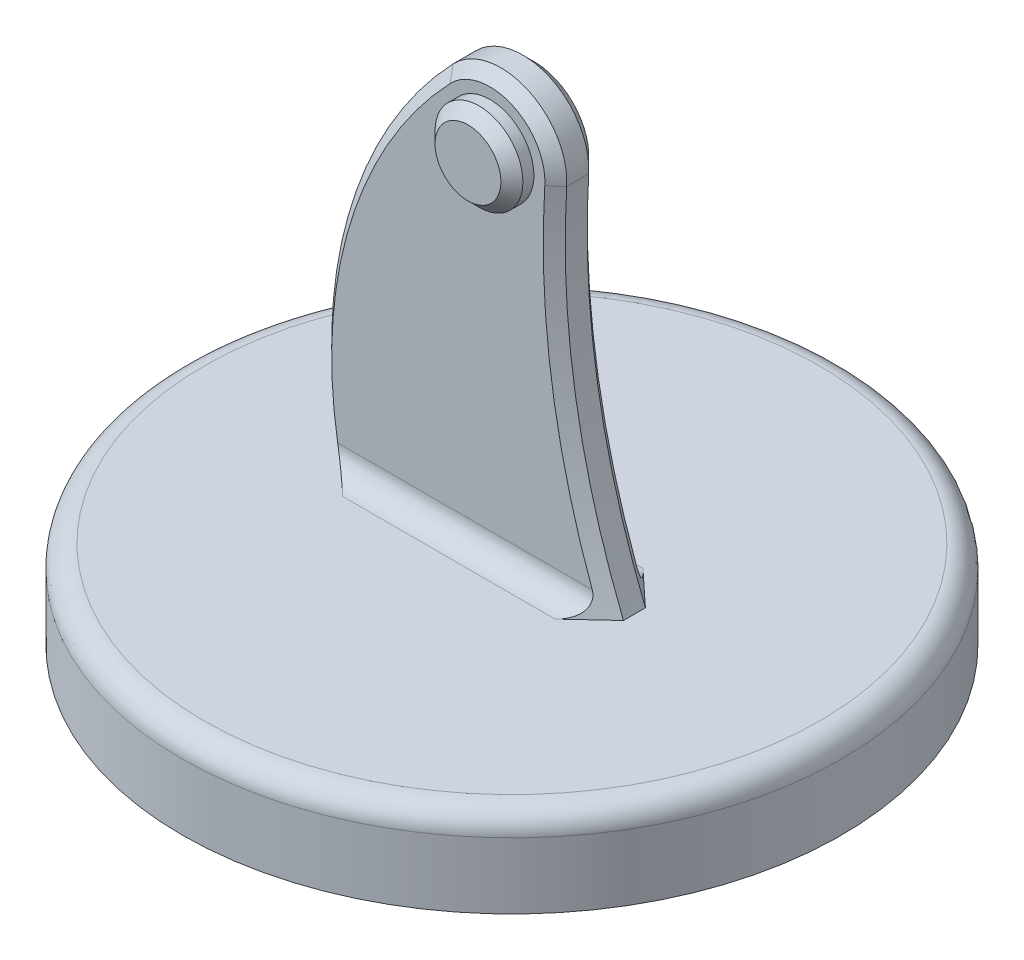
ISO-10303-21;
HEADER;
FILE_DESCRIPTION(('STEP AP214'),'2;1');
FILE_NAME('part.step','',(''),(''),'','','');
FILE_SCHEMA(('AUTOMOTIVE_DESIGN { 1 0 10303 214 1 1 1 1 }'));
ENDSEC;
DATA;
#1=APPLICATION_CONTEXT('core data for automotive mechanical design processes');
#2=APPLICATION_PROTOCOL_DEFINITION('international standard','automotive_design',2000,#1);
#3=PRODUCT_CONTEXT('',#1,'mechanical');
#4=PRODUCT('Part','Part','',(#3));
#5=PRODUCT_RELATED_PRODUCT_CATEGORY('part','',(#4));
#6=PRODUCT_DEFINITION_FORMATION('','',#4);
#7=PRODUCT_DEFINITION_CONTEXT('part definition',#1,'design');
#8=PRODUCT_DEFINITION('design','',#6,#7);
#9=PRODUCT_DEFINITION_SHAPE('','',#8);
#10=(LENGTH_UNIT() NAMED_UNIT(*) SI_UNIT(.MILLI.,.METRE.));
#11=(NAMED_UNIT(*) PLANE_ANGLE_UNIT() SI_UNIT($,.RADIAN.));
#12=(NAMED_UNIT(*) SI_UNIT($,.STERADIAN.) SOLID_ANGLE_UNIT());
#13=UNCERTAINTY_MEASURE_WITH_UNIT(LENGTH_MEASURE(1.E-05),#10,'distance_accuracy_value','');
#14=(GEOMETRIC_REPRESENTATION_CONTEXT(3) GLOBAL_UNCERTAINTY_ASSIGNED_CONTEXT((#13)) GLOBAL_UNIT_ASSIGNED_CONTEXT((#10,
#11,#12)) REPRESENTATION_CONTEXT('',''));
#15=CARTESIAN_POINT('',(0.,0.,0.));
#16=DIRECTION('',(0.,0.,1.));
#17=DIRECTION('',(1.,0.,0.));
#18=AXIS2_PLACEMENT_3D('',#15,#16,#17);
#19=CARTESIAN_POINT('',(0.,20.,0.));
#20=DIRECTION('',(0.,1.,0.));
#21=DIRECTION('',(0.,0.,1.));
#22=AXIS2_PLACEMENT_3D('',#19,#20,#21);
#23=PLANE('',#22);
#24=CARTESIAN_POINT('',(0.,20.,0.));
#25=DIRECTION('',(0.,1.,0.));
#26=DIRECTION('',(0.,0.,1.));
#27=AXIS2_PLACEMENT_3D('',#24,#25,#26);
#28=CIRCLE('',#27,70.);
#29=CARTESIAN_POINT('',(0.,20.,70.));
#30=VERTEX_POINT('',#29);
#31=EDGE_CURVE('E329',#30,#30,#28,.T.);
#32=ORIENTED_EDGE('',*,*,#31,.T.);
#33=EDGE_LOOP('',(#32));
#34=FACE_BOUND('',#33,.T.);
#35=CARTESIAN_POINT('',(-36.2257918410724,20.,-2.50000000000003));
#36=CARTESIAN_POINT('',(-35.372613344394,20.,-3.33359235450623));
#37=CARTESIAN_POINT('',(-34.5191891841924,20.,-4.16693335697092));
#38=CARTESIAN_POINT('',(-32.810937278002,20.,-5.83391380233447));
#39=CARTESIAN_POINT('',(-31.9561089872259,20.,-6.66755268694829));
#40=CARTESIAN_POINT('',(-30.2458713230933,20.,-8.33423473891845));
#41=CARTESIAN_POINT('',(-29.3904619495461,20.,-9.16727790607919));
#42=CARTESIAN_POINT('',(-28.5347400447996,20.,-9.99999999999038));
#43=B_SPLINE_CURVE_WITH_KNOTS('',3,(#35,#36,#37,#38,#39,#40,#41,#42),.UNSPECIFIED.,.F.,.F.,(4,2,
2,4),(0.,3.57842257820067,7.16048411375383,10.7425468249049),.UNSPECIFIED.);
#44=CARTESIAN_POINT('',(-36.2257918410724,20.,-2.50000000000003));
#45=VERTEX_POINT('',#44);
#46=CARTESIAN_POINT('',(-28.5347400447996,20.,-10.));
#47=VERTEX_POINT('',#46);
#48=EDGE_CURVE('E180',#45,#47,#43,.T.);
#49=ORIENTED_EDGE('',*,*,#48,.T.);
#50=DIRECTION('',(-1.,0.,0.));
#51=VECTOR('',#50,1.);
#52=CARTESIAN_POINT('',(25.1824752050036,20.,-10.));
#53=LINE('',#52,#51);
#54=CARTESIAN_POINT('',(19.8084097202195,20.,-10.));
#55=VERTEX_POINT('',#54);
#56=EDGE_CURVE('E273',#47,#55,#53,.F.);
#57=ORIENTED_EDGE('',*,*,#56,.T.);
#58=CARTESIAN_POINT('',(19.8084097202195,20.,-9.99999999999998));
#59=CARTESIAN_POINT('',(20.7032286114694,20.,-9.16574365323035));
#60=CARTESIAN_POINT('',(21.5984643871197,20.,-8.33193432974238));
#61=CARTESIAN_POINT('',(23.3898068938444,20.,-6.6652533617684));
#62=CARTESIAN_POINT('',(24.2859136241593,20.,-5.83238171646611));
#63=CARTESIAN_POINT('',(26.0805990637617,20.,-4.1661678404195));
#64=CARTESIAN_POINT('',(26.979179359604,20.,-3.33282731858596));
#65=CARTESIAN_POINT('',(27.8782351753599,20.,-2.50000000000003));
#66=B_SPLINE_CURVE_WITH_KNOTS('',3,(#58,#59,#60,#61,#62,#63,#64,#65),.UNSPECIFIED.,.F.,.F.,(4,2,
2,4),(0.,3.67017170974668,7.34034022201683,11.0169040821688),.UNSPECIFIED.);
#67=CARTESIAN_POINT('',(27.8782351753599,20.,-2.50000000000003));
#68=VERTEX_POINT('',#67);
#69=EDGE_CURVE('E126',#55,#68,#66,.T.);
#70=ORIENTED_EDGE('',*,*,#69,.T.);
#71=DIRECTION('',(0.,0.,-1.));
#72=VECTOR('',#71,1.);
#73=CARTESIAN_POINT('',(27.8782351753599,20.,5.));
#74=LINE('',#73,#72);
#75=CARTESIAN_POINT('',(27.8782351753599,20.,2.5));
#76=VERTEX_POINT('',#75);
#77=EDGE_CURVE('E137',#68,#76,#74,.F.);
#78=ORIENTED_EDGE('',*,*,#77,.T.);
#79=CARTESIAN_POINT('',(27.8782351753599,20.,2.5));
#80=CARTESIAN_POINT('',(26.979179359604,20.,3.33282731858594));
#81=CARTESIAN_POINT('',(26.0805990637617,20.,4.16616784041949));
#82=CARTESIAN_POINT('',(24.2859136241593,20.,5.8323817164661));
#83=CARTESIAN_POINT('',(23.3898068938444,20.,6.6652533617684));
#84=CARTESIAN_POINT('',(21.5984643871197,20.,8.33193432974238));
#85=CARTESIAN_POINT('',(20.7032286114694,20.,9.16574365323036));
#86=CARTESIAN_POINT('',(19.8084097202196,20.,10.));
#87=B_SPLINE_CURVE_WITH_KNOTS('',3,(#79,#80,#81,#82,#83,#84,#85,#86),.UNSPECIFIED.,.F.,.F.,(4,2,
2,4),(0.,3.676563860152,7.34673237242213,11.0169040821688),.UNSPECIFIED.);
#88=CARTESIAN_POINT('',(19.8084097202196,20.,10.));
#89=VERTEX_POINT('',#88);
#90=EDGE_CURVE('E125',#76,#89,#87,.T.);
#91=ORIENTED_EDGE('',*,*,#90,.T.);
#92=DIRECTION('',(-1.,0.,0.));
#93=VECTOR('',#92,1.);
#94=CARTESIAN_POINT('',(0.,20.,10.));
#95=LINE('',#94,#93);
#96=CARTESIAN_POINT('',(-28.5347400447898,20.,10.));
#97=VERTEX_POINT('',#96);
#98=EDGE_CURVE('E122',#89,#97,#95,.T.);
#99=ORIENTED_EDGE('',*,*,#98,.T.);
#100=CARTESIAN_POINT('',(-28.5347400447898,20.,10.));
#101=CARTESIAN_POINT('',(-29.3904619495379,20.,9.16727790608721));
#102=CARTESIAN_POINT('',(-30.2458713230867,20.,8.33423473892486));
#103=CARTESIAN_POINT('',(-31.9561089872226,20.,6.6675526869515));
#104=CARTESIAN_POINT('',(-32.8109372780004,20.,5.83391380233608));
#105=CARTESIAN_POINT('',(-34.5191891841924,20.,4.16693335697091));
#106=CARTESIAN_POINT('',(-35.372613344394,20.,3.33359235450622));
#107=CARTESIAN_POINT('',(-36.2257918410724,20.,2.5));
#108=B_SPLINE_CURVE_WITH_KNOTS('',3,(#100,#101,#102,#103,#104,#105,#106,#107),.UNSPECIFIED.,.F.,
.F.,(4,2,2,4),(0.,3.58206271115796,7.164124246718,10.7425468249187),.UNSPECIFIED.);
#109=CARTESIAN_POINT('',(-36.2257918410724,20.,2.5));
#110=VERTEX_POINT('',#109);
#111=EDGE_CURVE('E118',#97,#110,#108,.T.);
#112=ORIENTED_EDGE('',*,*,#111,.T.);
#113=DIRECTION('',(0.,0.,-1.));
#114=VECTOR('',#113,1.);
#115=CARTESIAN_POINT('',(-36.2257918410724,20.,5.));
#116=LINE('',#115,#114);
#117=EDGE_CURVE('E120',#110,#45,#116,.T.);
#118=ORIENTED_EDGE('',*,*,#117,.T.);
#119=EDGE_LOOP('',(#49,#57,#70,#78,#91,#99,#112,#118));
#120=FACE_BOUND('',#119,.T.);
#121=ADVANCED_FACE('F39',(#34,#120),#23,.T.);
#122=CARTESIAN_POINT('',(0.,20.,0.));
#123=DIRECTION('',(0.,-1.,0.));
#124=DIRECTION('',(0.,0.,-1.));
#125=AXIS2_PLACEMENT_3D('',#122,#123,#124);
#126=CYLINDRICAL_SURFACE('',#125,75.);
#127=CARTESIAN_POINT('',(0.,15.,0.));
#128=DIRECTION('',(0.,1.,0.));
#129=DIRECTION('',(0.,0.,1.));
#130=AXIS2_PLACEMENT_3D('',#127,#128,#129);
#131=CIRCLE('',#130,75.);
#132=CARTESIAN_POINT('',(0.,15.,75.));
#133=VERTEX_POINT('',#132);
#134=EDGE_CURVE('E326',#133,#133,#131,.F.);
#135=ORIENTED_EDGE('',*,*,#134,.T.);
#136=EDGE_LOOP('',(#135));
#137=FACE_BOUND('',#136,.T.);
#138=CARTESIAN_POINT('',(0.,0.,0.));
#139=DIRECTION('',(0.,1.,0.));
#140=DIRECTION('',(0.,0.,1.));
#141=AXIS2_PLACEMENT_3D('',#138,#139,#140);
#142=CIRCLE('',#141,75.);
#143=CARTESIAN_POINT('',(0.,0.,75.));
#144=VERTEX_POINT('',#143);
#145=EDGE_CURVE('E335',#144,#144,#142,.T.);
#146=ORIENTED_EDGE('',*,*,#145,.T.);
#147=EDGE_LOOP('',(#146));
#148=FACE_BOUND('',#147,.T.);
#149=ADVANCED_FACE('F202',(#137,#148),#126,.T.);
#150=CARTESIAN_POINT('',(0.,0.,0.));
#151=DIRECTION('',(0.,1.,0.));
#152=DIRECTION('',(0.,0.,1.));
#153=AXIS2_PLACEMENT_3D('',#150,#151,#152);
#154=PLANE('',#153);
#155=ORIENTED_EDGE('',*,*,#145,.F.);
#156=EDGE_LOOP('',(#155));
#157=FACE_BOUND('',#156,.T.);
#158=ADVANCED_FACE('F205',(#157),#154,.F.);
#159=CARTESIAN_POINT('',(0.,15.,0.));
#160=DIRECTION('',(0.,1.,0.));
#161=DIRECTION('',(0.,0.,1.));
#162=AXIS2_PLACEMENT_3D('',#159,#160,#161);
#163=TOROIDAL_SURFACE('',#162,70.,5.);
#164=ORIENTED_EDGE('',*,*,#134,.F.);
#165=EDGE_LOOP('',(#164));
#166=FACE_BOUND('',#165,.T.);
#167=ORIENTED_EDGE('',*,*,#31,.F.);
#168=EDGE_LOOP('',(#167));
#169=FACE_BOUND('',#168,.T.);
#170=ADVANCED_FACE('F378',(#166,#169),#163,.T.);
#171=CARTESIAN_POINT('',(61.4788080980091,41.3028437243492,5.));
#172=DIRECTION('',(0.,0.,-1.));
#173=DIRECTION('',(-1.,0.,0.));
#174=AXIS2_PLACEMENT_3D('',#171,#172,#173);
#175=CYLINDRICAL_SURFACE('',#174,100.);
#176=DIRECTION('',(0.,0.,-1.));
#177=VECTOR('',#176,1.);
#178=CARTESIAN_POINT('',(-10.8492014290605,110.358321695703,5.));
#179=LINE('',#178,#177);
#180=CARTESIAN_POINT('',(-10.8492014290605,110.358321695703,2.5));
#181=VERTEX_POINT('',#180);
#182=CARTESIAN_POINT('',(-10.8492014290605,110.358321695703,-2.50000000000003));
#183=VERTEX_POINT('',#182);
#184=EDGE_CURVE('E294',#181,#183,#179,.T.);
#185=ORIENTED_EDGE('',*,*,#184,.T.);
#186=CARTESIAN_POINT('',(61.4788080980091,41.3028437243492,-2.50000000000003));
#187=DIRECTION('',(0.,0.,-1.));
#188=DIRECTION('',(-1.,0.,0.));
#189=AXIS2_PLACEMENT_3D('',#186,#187,#188);
#190=CIRCLE('',#189,100.);
#191=EDGE_CURVE('E135',#183,#45,#190,.F.);
#192=ORIENTED_EDGE('',*,*,#191,.T.);
#193=ORIENTED_EDGE('',*,*,#117,.F.);
#194=CARTESIAN_POINT('',(61.4788080980091,41.3028437243492,2.5));
#195=DIRECTION('',(0.,0.,-1.));
#196=DIRECTION('',(-1.,0.,0.));
#197=AXIS2_PLACEMENT_3D('',#194,#195,#196);
#198=CIRCLE('',#197,100.);
#199=EDGE_CURVE('E132',#110,#181,#198,.T.);
#200=ORIENTED_EDGE('',*,*,#199,.T.);
#201=EDGE_LOOP('',(#185,#192,#193,#200));
#202=FACE_BOUND('',#201,.T.);
#203=ADVANCED_FACE('F131',(#202),#175,.T.);
#204=CARTESIAN_POINT('',(194.618391581677,87.8064911464742,5.));
#205=DIRECTION('',(0.,0.,-1.));
#206=DIRECTION('',(-1.,0.,0.));
#207=AXIS2_PLACEMENT_3D('',#204,#205,#206);
#208=CYLINDRICAL_SURFACE('',#207,180.);
#209=ORIENTED_EDGE('',*,*,#77,.F.);
#210=CARTESIAN_POINT('',(194.618391581677,87.8064911464742,-2.50000000000003));
#211=DIRECTION('',(0.,0.,-1.));
#212=DIRECTION('',(-1.,0.,0.));
#213=AXIS2_PLACEMENT_3D('',#210,#211,#212);
#214=CIRCLE('',#213,180.);
#215=CARTESIAN_POINT('',(14.9706455062829,99.062037780498,-2.50000000000003));
#216=VERTEX_POINT('',#215);
#217=EDGE_CURVE('E168',#68,#216,#214,.T.);
#218=ORIENTED_EDGE('',*,*,#217,.T.);
#219=DIRECTION('',(0.,0.,-1.));
#220=VECTOR('',#219,1.);
#221=CARTESIAN_POINT('',(14.9706455062829,99.062037780498,5.));
#222=LINE('',#221,#220);
#223=CARTESIAN_POINT('',(14.9706455062829,99.062037780498,2.5));
#224=VERTEX_POINT('',#223);
#225=EDGE_CURVE('E339',#224,#216,#222,.T.);
#226=ORIENTED_EDGE('',*,*,#225,.F.);
#227=CARTESIAN_POINT('',(194.618391581677,87.8064911464742,2.5));
#228=DIRECTION('',(0.,0.,-1.));
#229=DIRECTION('',(-1.,0.,0.));
#230=AXIS2_PLACEMENT_3D('',#227,#228,#229);
#231=CIRCLE('',#230,180.);
#232=EDGE_CURVE('E165',#224,#76,#231,.F.);
#233=ORIENTED_EDGE('',*,*,#232,.T.);
#234=EDGE_LOOP('',(#209,#218,#226,#233));
#235=FACE_BOUND('',#234,.T.);
#236=ADVANCED_FACE('F321',(#235),#208,.F.);
#237=CARTESIAN_POINT('',(0.,100.,5.));
#238=DIRECTION('',(0.,0.,-1.));
#239=DIRECTION('',(-1.,0.,0.));
#240=AXIS2_PLACEMENT_3D('',#237,#238,#239);
#241=CYLINDRICAL_SURFACE('',#240,15.0000000000001);
#242=ORIENTED_EDGE('',*,*,#225,.T.);
#243=CARTESIAN_POINT('',(0.,100.,-2.50000000000003));
#244=DIRECTION('',(0.,0.,-1.));
#245=DIRECTION('',(-1.,0.,0.));
#246=AXIS2_PLACEMENT_3D('',#243,#244,#245);
#247=CIRCLE('',#246,15.0000000000001);
#248=EDGE_CURVE('E162',#216,#183,#247,.F.);
#249=ORIENTED_EDGE('',*,*,#248,.T.);
#250=ORIENTED_EDGE('',*,*,#184,.F.);
#251=CARTESIAN_POINT('',(0.,100.,2.5));
#252=DIRECTION('',(0.,0.,-1.));
#253=DIRECTION('',(-1.,0.,0.));
#254=AXIS2_PLACEMENT_3D('',#251,#252,#253);
#255=CIRCLE('',#254,15.0000000000001);
#256=EDGE_CURVE('E159',#181,#224,#255,.T.);
#257=ORIENTED_EDGE('',*,*,#256,.T.);
#258=EDGE_LOOP('',(#242,#249,#250,#257));
#259=FACE_BOUND('',#258,.T.);
#260=ADVANCED_FACE('F367',(#259),#241,.T.);
#261=CARTESIAN_POINT('',(61.4788080980091,41.3028437243492,5.));
#262=DIRECTION('',(0.,0.,-1.));
#263=DIRECTION('',(-1.,0.,0.));
#264=AXIS2_PLACEMENT_3D('',#261,#262,#263);
#265=PLANE('',#264);
#266=CARTESIAN_POINT('',(0.,100.,5.));
#267=DIRECTION('',(0.,0.,-1.));
#268=DIRECTION('',(-1.,0.,0.));
#269=AXIS2_PLACEMENT_3D('',#266,#267,#268);
#270=CIRCLE('',#269,10.);
#271=CARTESIAN_POINT('',(-10.,100.,5.));
#272=VERTEX_POINT('',#271);
#273=EDGE_CURVE('E536',#272,#272,#270,.F.);
#274=ORIENTED_EDGE('',*,*,#273,.F.);
#275=EDGE_LOOP('',(#274));
#276=FACE_BOUND('',#275,.T.);
#277=CARTESIAN_POINT('',(61.4788080980091,41.3028437243492,5.));
#278=DIRECTION('',(0.,0.,-1.));
#279=DIRECTION('',(-1.,0.,0.));
#280=AXIS2_PLACEMENT_3D('',#277,#278,#279);
#281=CIRCLE('',#280,97.5);
#282=CARTESIAN_POINT('',(-9.04100119088374,108.631934746419,5.));
#283=VERTEX_POINT('',#282);
#284=CARTESIAN_POINT('',(-34.6485412178826,25.,5.));
#285=VERTEX_POINT('',#284);
#286=EDGE_CURVE('E177',#283,#285,#281,.F.);
#287=ORIENTED_EDGE('',*,*,#286,.T.);
#288=DIRECTION('',(-1.,0.,0.));
#289=VECTOR('',#288,1.);
#290=CARTESIAN_POINT('',(61.4788080980091,25.,5.));
#291=LINE('',#290,#289);
#292=CARTESIAN_POINT('',(23.2661384016624,25.,5.));
#293=VERTEX_POINT('',#292);
#294=EDGE_CURVE('E55',#285,#293,#291,.F.);
#295=ORIENTED_EDGE('',*,*,#294,.T.);
#296=CARTESIAN_POINT('',(194.618391581677,87.8064911464742,5.));
#297=DIRECTION('',(0.,0.,-1.));
#298=DIRECTION('',(-1.,0.,0.));
#299=AXIS2_PLACEMENT_3D('',#296,#297,#298);
#300=CIRCLE('',#299,182.5);
#301=CARTESIAN_POINT('',(12.4755379219024,99.2183648170816,5.));
#302=VERTEX_POINT('',#301);
#303=EDGE_CURVE('E171',#293,#302,#300,.T.);
#304=ORIENTED_EDGE('',*,*,#303,.T.);
#305=CARTESIAN_POINT('',(0.,100.,5.));
#306=DIRECTION('',(0.,0.,-1.));
#307=DIRECTION('',(-1.,0.,0.));
#308=AXIS2_PLACEMENT_3D('',#305,#306,#307);
#309=CIRCLE('',#308,12.5000000000001);
#310=EDGE_CURVE('E174',#302,#283,#309,.F.);
#311=ORIENTED_EDGE('',*,*,#310,.T.);
#312=EDGE_LOOP('',(#287,#295,#304,#311));
#313=FACE_BOUND('',#312,.T.);
#314=ADVANCED_FACE('F361',(#276,#313),#265,.F.);
#315=CARTESIAN_POINT('',(61.4788080980091,41.3028437243492,-5.));
#316=DIRECTION('',(0.,0.,-1.));
#317=DIRECTION('',(-1.,0.,0.));
#318=AXIS2_PLACEMENT_3D('',#315,#316,#317);
#319=PLANE('',#318);
#320=CARTESIAN_POINT('',(0.,100.,-5.));
#321=DIRECTION('',(0.,0.,-1.));
#322=DIRECTION('',(-1.,0.,0.));
#323=AXIS2_PLACEMENT_3D('',#320,#321,#322);
#324=CIRCLE('',#323,5.);
#325=CARTESIAN_POINT('',(-5.,100.,-5.));
#326=VERTEX_POINT('',#325);
#327=EDGE_CURVE('E344',#326,#326,#324,.T.);
#328=ORIENTED_EDGE('',*,*,#327,.F.);
#329=EDGE_LOOP('',(#328));
#330=FACE_BOUND('',#329,.T.);
#331=CARTESIAN_POINT('',(194.618391581677,87.8064911464742,-5.));
#332=DIRECTION('',(0.,0.,-1.));
#333=DIRECTION('',(-1.,0.,0.));
#334=AXIS2_PLACEMENT_3D('',#331,#332,#333);
#335=CIRCLE('',#334,182.5);
#336=CARTESIAN_POINT('',(12.4755379219024,99.2183648170816,-5.));
#337=VERTEX_POINT('',#336);
#338=CARTESIAN_POINT('',(23.2661384016624,25.,-5.));
#339=VERTEX_POINT('',#338);
#340=EDGE_CURVE('E146',#337,#339,#335,.F.);
#341=ORIENTED_EDGE('',*,*,#340,.T.);
#342=DIRECTION('',(-1.,0.,0.));
#343=VECTOR('',#342,1.);
#344=CARTESIAN_POINT('',(-33.6654972978261,25.,-5.));
#345=LINE('',#344,#343);
#346=CARTESIAN_POINT('',(-34.6485412178826,25.,-5.));
#347=VERTEX_POINT('',#346);
#348=EDGE_CURVE('E279',#339,#347,#345,.T.);
#349=ORIENTED_EDGE('',*,*,#348,.T.);
#350=CARTESIAN_POINT('',(61.4788080980091,41.3028437243492,-5.));
#351=DIRECTION('',(0.,0.,-1.));
#352=DIRECTION('',(-1.,0.,0.));
#353=AXIS2_PLACEMENT_3D('',#350,#351,#352);
#354=CIRCLE('',#353,97.5);
#355=CARTESIAN_POINT('',(-9.04100119088374,108.631934746419,-5.));
#356=VERTEX_POINT('',#355);
#357=EDGE_CURVE('E156',#347,#356,#354,.T.);
#358=ORIENTED_EDGE('',*,*,#357,.T.);
#359=CARTESIAN_POINT('',(0.,100.,-5.));
#360=DIRECTION('',(0.,0.,-1.));
#361=DIRECTION('',(-1.,0.,0.));
#362=AXIS2_PLACEMENT_3D('',#359,#360,#361);
#363=CIRCLE('',#362,12.5000000000001);
#364=EDGE_CURVE('E153',#356,#337,#363,.T.);
#365=ORIENTED_EDGE('',*,*,#364,.T.);
#366=EDGE_LOOP('',(#341,#349,#358,#365));
#367=FACE_BOUND('',#366,.T.);
#368=ADVANCED_FACE('F307',(#330,#367),#319,.T.);
#369=CARTESIAN_POINT('',(194.618391581677,87.8064911464742,-2.50000000000003));
#370=DIRECTION('',(0.,0.,-1.));
#371=DIRECTION('',(-1.,0.,0.));
#372=AXIS2_PLACEMENT_3D('',#369,#370,#371);
#373=CONICAL_SURFACE('',#372,180.,0.785398163397454);
#374=ORIENTED_EDGE('',*,*,#69,.F.);
#375=CARTESIAN_POINT('',(19.8084097202195,20.,-10.));
#376=CARTESIAN_POINT('',(19.9616222001359,20.0000298804788,-9.85714704113472));
#377=CARTESIAN_POINT('',(20.113792401427,20.0061250464787,-9.71309524720426));
#378=CARTESIAN_POINT('',(20.4154099258562,20.0312732005136,-9.42286389259004));
#379=CARTESIAN_POINT('',(20.5648530266057,20.0503447774578,-9.27668157427059));
#380=CARTESIAN_POINT('',(20.8615528966934,20.102562652016,-8.98125926298964));
#381=CARTESIAN_POINT('',(21.0087676549954,20.1358611613083,-8.83200332023086));
#382=CARTESIAN_POINT('',(21.2980316141233,20.2175964036354,-8.53280806026068));
#383=CARTESIAN_POINT('',(21.4400838108924,20.2660241950172,-8.38286919811182));
#384=CARTESIAN_POINT('',(21.7828151280985,20.4058352198909,-8.01276165533595));
#385=CARTESIAN_POINT('',(21.9797828513875,20.5067135935973,-7.79259954802385));
#386=CARTESIAN_POINT('',(22.3528762269486,20.7482032050806,-7.35729519112309));
#387=CARTESIAN_POINT('',(22.5290705137557,20.8886780845711,-7.14213841034353));
#388=CARTESIAN_POINT('',(22.8168193138976,21.1785477540737,-6.76898245708678));
#389=CARTESIAN_POINT('',(22.9340909878662,21.319317167827,-6.60875060095627));
#390=CARTESIAN_POINT('',(23.1447782575429,21.6294430522973,-6.30040897895643));
#391=CARTESIAN_POINT('',(23.2382153446302,21.7987735392681,-6.15228837499195));
#392=CARTESIAN_POINT('',(23.3804737185194,22.1320581970212,-5.89995104941321));
#393=CARTESIAN_POINT('',(23.434296278932,22.2915049540279,-5.79262885058204));
#394=CARTESIAN_POINT('',(23.5179262343763,22.6263855761311,-5.5950448914265));
#395=CARTESIAN_POINT('',(23.5477623016994,22.8018000739712,-5.50476286123898));
#396=CARTESIAN_POINT('',(23.5813327898913,23.1648092903734,-5.34473112728066));
#397=CARTESIAN_POINT('',(23.5849884501376,23.3524390501042,-5.27504398310997));
#398=CARTESIAN_POINT('',(23.5658130806125,23.733709875505,-5.15889768650512));
#399=CARTESIAN_POINT('',(23.5429456120538,23.9273588546123,-5.11247061551667));
#400=CARTESIAN_POINT('',(23.4808763212381,24.2692712797722,-5.05137708232072));
#401=CARTESIAN_POINT('',(23.446701744559,24.4176298806951,-5.03183845273442));
#402=CARTESIAN_POINT('',(23.3858266399032,24.63802725972,-5.01257591131647));
#403=CARTESIAN_POINT('',(23.3639728403138,24.7110279587234,-5.00782892798884));
#404=CARTESIAN_POINT('',(23.3172604092299,24.8561887780631,-5.00154052901006));
#405=CARTESIAN_POINT('',(23.2924023157314,24.92834904637,-4.99999854031963));
#406=CARTESIAN_POINT('',(23.2661384016624,25.,-4.99999999999999));
#407=B_SPLINE_CURVE_WITH_KNOTS('',3,(#375,#376,#377,#378,#379,#380,#381,#382,#383,#384,#385,
#386,#387,#388,#389,#390,#391,#392,#393,#394,#395,#396,#397,#398,#399,#400,#401,#402,#403,#404,
#405,#406),.UNSPECIFIED.,.F.,.F.,(4,2,2,2,2,2,2,2,2,2,2,2,2,2,2,4),(0.,0.628421039599246,
1.25774420264553,1.89397597557041,2.52983243422467,3.46357701051969,4.39414453597986,
5.12178326458136,5.84876355163269,6.44503340286867,7.04058943781574,7.63793638210259,
8.23610496423002,8.69534624701096,8.92427835401007,9.15316952540915),.UNSPECIFIED.);
#408=EDGE_CURVE('E239',#55,#339,#407,.T.);
#409=ORIENTED_EDGE('',*,*,#408,.T.);
#410=ORIENTED_EDGE('',*,*,#340,.F.);
#411=DIRECTION('',(-0.705722997082166,0.0442159630604432,-0.707106781186549));
#412=VECTOR('',#411,1.);
#413=CARTESIAN_POINT('',(14.9706455062829,99.062037780498,-2.50000000000003));
#414=LINE('',#413,#412);
#415=EDGE_CURVE('E291',#216,#337,#414,.T.);
#416=ORIENTED_EDGE('',*,*,#415,.F.);
#417=ORIENTED_EDGE('',*,*,#217,.F.);
#418=EDGE_LOOP('',(#374,#409,#410,#416,#417));
#419=FACE_BOUND('',#418,.T.);
#420=ADVANCED_FACE('F227',(#419),#373,.F.);
#421=CARTESIAN_POINT('',(0.,100.,-2.50000000000003));
#422=DIRECTION('',(0.,0.,1.));
#423=DIRECTION('',(1.,0.,0.));
#424=AXIS2_PLACEMENT_3D('',#421,#422,#423);
#425=CONICAL_SURFACE('',#424,15.0000000000001,0.785398163397451);
#426=ORIENTED_EDGE('',*,*,#415,.T.);
#427=ORIENTED_EDGE('',*,*,#364,.F.);
#428=DIRECTION('',(0.511436260063162,-0.488295967516228,-0.707106781186545));
#429=VECTOR('',#428,1.);
#430=CARTESIAN_POINT('',(-10.8492014290605,110.358321695703,-2.50000000000003));
#431=LINE('',#430,#429);
#432=EDGE_CURVE('E287',#183,#356,#431,.T.);
#433=ORIENTED_EDGE('',*,*,#432,.F.);
#434=ORIENTED_EDGE('',*,*,#248,.F.);
#435=EDGE_LOOP('',(#426,#427,#433,#434));
#436=FACE_BOUND('',#435,.T.);
#437=ADVANCED_FACE('F303',(#436),#425,.T.);
#438=CARTESIAN_POINT('',(61.4788080980091,41.3028437243492,-2.50000000000003));
#439=DIRECTION('',(0.,0.,1.));
#440=DIRECTION('',(1.,0.,0.));
#441=AXIS2_PLACEMENT_3D('',#438,#439,#440);
#442=CONICAL_SURFACE('',#441,100.,0.785398163397451);
#443=ORIENTED_EDGE('',*,*,#432,.T.);
#444=ORIENTED_EDGE('',*,*,#357,.F.);
#445=CARTESIAN_POINT('',(-34.6485412178826,25.,-5.));
#446=CARTESIAN_POINT('',(-34.6278263931646,24.8776737195309,-4.99997205696549));
#447=CARTESIAN_POINT('',(-34.6024065399032,24.7562262915276,-5.00448739117207));
#448=CARTESIAN_POINT('',(-34.5429849208855,24.5162780856462,-5.02201019394859));
#449=CARTESIAN_POINT('',(-34.508997529844,24.3977727337697,-5.03500349551893));
#450=CARTESIAN_POINT('',(-34.4336064530607,24.1657504184647,-5.06870753536354));
#451=CARTESIAN_POINT('',(-34.3922873438699,24.0521932495797,-5.08933290323475));
#452=CARTESIAN_POINT('',(-34.3028186663442,23.8293395597508,-5.13763804893629));
#453=CARTESIAN_POINT('',(-34.2546663483715,23.7200447766429,-5.16532067014758));
#454=CARTESIAN_POINT('',(-34.1018999874642,23.4007855163625,-5.25749953763443));
#455=CARTESIAN_POINT('',(-33.9883894250089,23.1977010164338,-5.33139897333394));
#456=CARTESIAN_POINT('',(-33.743108128065,22.8114075187661,-5.49947966844371));
#457=CARTESIAN_POINT('',(-33.6112792288648,22.6282652833932,-5.59372608368114));
#458=CARTESIAN_POINT('',(-33.3597715899798,22.3143795242672,-5.77930779563057));
#459=CARTESIAN_POINT('',(-33.2423430904442,22.1802045011359,-5.86796813176537));
#460=CARTESIAN_POINT('',(-33.0003701704359,21.9250062885372,-6.05419427532001));
#461=CARTESIAN_POINT('',(-32.875822262786,21.803989629899,-6.15176446112315));
#462=CARTESIAN_POINT('',(-32.6209581839141,21.574515672378,-6.35451763345837));
#463=CARTESIAN_POINT('',(-32.4906317175558,21.4660821453441,-6.45971443821714));
#464=CARTESIAN_POINT('',(-32.2256565914919,21.261571364397,-6.67639624695992));
#465=CARTESIAN_POINT('',(-32.0910081512861,21.1654934842151,-6.78788093181872));
#466=CARTESIAN_POINT('',(-31.7670829795191,20.9513521781691,-7.05916234626261));
#467=CARTESIAN_POINT('',(-31.5762977372455,20.8386006241571,-7.22136644551831));
#468=CARTESIAN_POINT('',(-31.19037990133,20.6347373401019,-7.55407285197029));
#469=CARTESIAN_POINT('',(-30.9952453847091,20.543635398434,-7.7245788708709));
#470=CARTESIAN_POINT('',(-30.6024455629516,20.3825905264103,-8.07225279463921));
#471=CARTESIAN_POINT('',(-30.4047817757244,20.312635473578,-8.24941681705511));
#472=CARTESIAN_POINT('',(-30.0083154260172,20.1935947017099,-8.60919264195972));
#473=CARTESIAN_POINT('',(-29.8095134145846,20.144499628215,-8.79180196315537));
#474=CARTESIAN_POINT('',(-29.4304409321059,20.0707858186542,-9.14430295407239));
#475=CARTESIAN_POINT('',(-29.2501629713124,20.0443183217429,-9.31380200505619));
#476=CARTESIAN_POINT('',(-28.891175594643,20.0089730286601,-9.65518491269287));
#477=CARTESIAN_POINT('',(-28.7124631020955,20.0000429318062,-9.82706013433487));
#478=CARTESIAN_POINT('',(-28.5347400447949,20.,-9.99999999999494));
#479=B_SPLINE_CURVE_WITH_KNOTS('',3,(#445,#446,#447,#448,#449,#450,#451,#452,#453,#454,#455,
#456,#457,#458,#459,#460,#461,#462,#463,#464,#465,#466,#467,#468,#469,#470,#471,#472,#473,#474,
#475,#476,#477,#478),.UNSPECIFIED.,.F.,.F.,(4,2,2,2,2,2,2,2,2,2,2,2,2,2,2,2,4),(0.,
0.371910340457605,0.74320079101391,1.11045779196236,1.47786299596238,2.20715942536886,
2.93882682183086,3.53541228861898,4.13229251712417,4.73028261116159,5.32824238300982,
6.15097947183996,6.9740878376438,7.7967234569874,8.61898978287113,9.36494146338215,
10.1086651405441),.UNSPECIFIED.);
#480=EDGE_CURVE('E263',#347,#47,#479,.T.);
#481=ORIENTED_EDGE('',*,*,#480,.T.);
#482=ORIENTED_EDGE('',*,*,#48,.F.);
#483=ORIENTED_EDGE('',*,*,#191,.F.);
#484=EDGE_LOOP('',(#443,#444,#481,#482,#483));
#485=FACE_BOUND('',#484,.T.);
#486=ADVANCED_FACE('F194',(#485),#442,.T.);
#487=CARTESIAN_POINT('',(194.618391581677,87.8064911464742,5.));
#488=DIRECTION('',(0.,0.,1.));
#489=DIRECTION('',(1.,0.,0.));
#490=AXIS2_PLACEMENT_3D('',#487,#488,#489);
#491=CONICAL_SURFACE('',#490,182.5,0.785398163397448);
#492=ORIENTED_EDGE('',*,*,#90,.F.);
#493=ORIENTED_EDGE('',*,*,#232,.F.);
#494=DIRECTION('',(0.705722997082169,-0.0442159630604425,-0.707106781186546));
#495=VECTOR('',#494,1.);
#496=CARTESIAN_POINT('',(12.4755379219024,99.2183648170816,5.));
#497=LINE('',#496,#495);
#498=EDGE_CURVE('E283',#302,#224,#497,.T.);
#499=ORIENTED_EDGE('',*,*,#498,.F.);
#500=ORIENTED_EDGE('',*,*,#303,.F.);
#501=CARTESIAN_POINT('',(23.2661384016624,25.,5.));
#502=CARTESIAN_POINT('',(23.3002005671833,24.9070970588888,4.99998982101167));
#503=CARTESIAN_POINT('',(23.3319003658589,24.8132947634358,5.00258916549921));
#504=CARTESIAN_POINT('',(23.3901604515583,24.6243431264429,5.01323591479231));
#505=CARTESIAN_POINT('',(23.4167170425788,24.5291928685387,5.02128721893148));
#506=CARTESIAN_POINT('',(23.4642590261445,24.3379983044757,5.04308274610182));
#507=CARTESIAN_POINT('',(23.4852365999853,24.2419529368185,5.05683489026829));
#508=CARTESIAN_POINT('',(23.5211837982654,24.0497650147842,5.09015681555102));
#509=CARTESIAN_POINT('',(23.536154895162,23.9536224900254,5.10972516880294));
#510=CARTESIAN_POINT('',(23.559843473077,23.7615087850931,5.15480488443815));
#511=CARTESIAN_POINT('',(23.5685335526406,23.6655401561134,5.18034165170114));
#512=CARTESIAN_POINT('',(23.579358971121,23.4749236099918,5.23722376580067));
#513=CARTESIAN_POINT('',(23.581491975839,23.3802761751034,5.26857117691084));
#514=CARTESIAN_POINT('',(23.5791344482646,23.1932936963799,5.33677201100209));
#515=CARTESIAN_POINT('',(23.5746576512134,23.1009542616796,5.37361387353918));
#516=CARTESIAN_POINT('',(23.5591775223305,22.9190612464289,5.4525252464123));
#517=CARTESIAN_POINT('',(23.5481717304809,22.8295087293356,5.49459672245526));
#518=CARTESIAN_POINT('',(23.5205328957291,22.6581681393704,5.58133674973436));
#519=CARTESIAN_POINT('',(23.5042028834638,22.5762147571266,5.62577615786904));
#520=CARTESIAN_POINT('',(23.4660960259121,22.4158463901558,5.71855815688246));
#521=CARTESIAN_POINT('',(23.444317399856,22.3374325721739,5.76690202034878));
#522=CARTESIAN_POINT('',(23.3712669897884,22.1079558946016,5.91717329223246));
#523=CARTESIAN_POINT('',(23.3122859316015,21.9626892734793,6.02432427062644));
#524=CARTESIAN_POINT('',(23.1519246056421,21.6389242665394,6.29030441266749));
#525=CARTESIAN_POINT('',(23.0429297160746,21.4679275550974,6.45361876347934));
#526=CARTESIAN_POINT('',(22.8002588719763,21.1580788280493,6.79181102146747));
#527=CARTESIAN_POINT('',(22.6665421365392,21.0192807927284,6.96670772427777));
#528=CARTESIAN_POINT('',(22.3197638247351,20.7186526437609,7.39885475877631));
#529=CARTESIAN_POINT('',(22.0972299147783,20.5723698914755,7.65932857124402));
#530=CARTESIAN_POINT('',(21.7458214725293,20.3928428518393,8.05194856088026));
#531=CARTESIAN_POINT('',(21.6254999159944,20.3395856596789,8.1833971595542));
#532=CARTESIAN_POINT('',(21.380034828669,20.2454846645251,8.44627656448097));
#533=CARTESIAN_POINT('',(21.2548922835546,20.2046383390843,8.57770736891522));
#534=CARTESIAN_POINT('',(21.0216039690425,20.1402893934768,8.81843555286569));
#535=CARTESIAN_POINT('',(20.9140295433624,20.115042165326,8.92783397103436));
#536=CARTESIAN_POINT('',(20.6966536902157,20.0722321318853,9.14592246129717));
#537=CARTESIAN_POINT('',(20.5868522553935,20.0546693519809,9.25461253105013));
#538=CARTESIAN_POINT('',(20.3664141647907,20.0269838470988,9.47008454014684));
#539=CARTESIAN_POINT('',(20.2557937252114,20.0167960789621,9.57687485159776));
#540=CARTESIAN_POINT('',(20.0331107499653,20.0033093732439,9.78932326315867));
#541=CARTESIAN_POINT('',(19.9210486204086,20.0000085366556,9.89498166738485));
#542=CARTESIAN_POINT('',(19.8084097202196,20.,10.));
#543=B_SPLINE_CURVE_WITH_KNOTS('',3,(#501,#502,#503,#504,#505,#506,#507,#508,#509,#510,#511,
#512,#513,#514,#515,#516,#517,#518,#519,#520,#521,#522,#523,#524,#525,#526,#527,#528,#529,#530,
#531,#532,#533,#534,#535,#536,#537,#538,#539,#540,#541,#542),.UNSPECIFIED.,.F.,.F.,(4,2,2,2,2,2,
2,2,2,2,2,2,2,2,2,2,2,2,2,2,4),(0.,0.296831377796521,0.593875278954085,0.89133330393898,
1.18871836397787,1.48739308625394,1.78617411897321,2.08433515458884,2.38260860379722,
2.66622794573054,2.9499401043005,3.51747042312949,4.29430082789705,5.07242430682301,
6.18341813208101,6.74108455291985,7.29863755488187,7.76491483358029,8.23119365260231,
8.69330833935968,9.15529558547914),.UNSPECIFIED.);
#544=EDGE_CURVE('E238',#293,#89,#543,.T.);
#545=ORIENTED_EDGE('',*,*,#544,.T.);
#546=EDGE_LOOP('',(#492,#493,#499,#500,#545));
#547=FACE_BOUND('',#546,.T.);
#548=ADVANCED_FACE('F260',(#547),#491,.F.);
#549=CARTESIAN_POINT('',(0.,100.,5.));
#550=DIRECTION('',(0.,0.,-1.));
#551=DIRECTION('',(-1.,0.,0.));
#552=AXIS2_PLACEMENT_3D('',#549,#550,#551);
#553=CONICAL_SURFACE('',#552,12.5000000000001,0.785398163397445);
#554=ORIENTED_EDGE('',*,*,#498,.T.);
#555=ORIENTED_EDGE('',*,*,#256,.F.);
#556=DIRECTION('',(-0.51143626006316,0.488295967516222,-0.707106781186551));
#557=VECTOR('',#556,1.);
#558=CARTESIAN_POINT('',(-9.04100119088374,108.631934746419,5.));
#559=LINE('',#558,#557);
#560=EDGE_CURVE('E142',#283,#181,#559,.T.);
#561=ORIENTED_EDGE('',*,*,#560,.F.);
#562=ORIENTED_EDGE('',*,*,#310,.F.);
#563=EDGE_LOOP('',(#554,#555,#561,#562));
#564=FACE_BOUND('',#563,.T.);
#565=ADVANCED_FACE('F226',(#564),#553,.T.);
#566=CARTESIAN_POINT('',(61.4788080980091,41.3028437243492,5.));
#567=DIRECTION('',(0.,0.,-1.));
#568=DIRECTION('',(-1.,0.,0.));
#569=AXIS2_PLACEMENT_3D('',#566,#567,#568);
#570=CONICAL_SURFACE('',#569,97.5,0.785398163397446);
#571=ORIENTED_EDGE('',*,*,#560,.T.);
#572=ORIENTED_EDGE('',*,*,#199,.F.);
#573=ORIENTED_EDGE('',*,*,#111,.F.);
#574=CARTESIAN_POINT('',(-28.5347400447898,20.,10.));
#575=CARTESIAN_POINT('',(-28.6394037298975,20.000005434771,9.89815059591555));
#576=CARTESIAN_POINT('',(-28.7444044701097,20.0031117141702,9.79667872726325));
#577=CARTESIAN_POINT('',(-28.9548959740975,20.015430758412,9.59462953884507));
#578=CARTESIAN_POINT('',(-29.06038670815,20.0246431575365,9.49405216587013));
#579=CARTESIAN_POINT('',(-29.3774210581305,20.0613070700193,9.19377282554194));
#580=CARTESIAN_POINT('',(-29.5894429565537,20.0977851443199,8.99560518423251));
#581=CARTESIAN_POINT('',(-30.0149470348642,20.1948303369437,8.60300164617535));
#582=CARTESIAN_POINT('',(-30.2284255574995,20.2556075268316,8.40861421626865));
#583=CARTESIAN_POINT('',(-30.6533009098754,20.4012836398836,8.02679361368094));
#584=CARTESIAN_POINT('',(-30.864698419037,20.486174400497,7.8393581119736));
#585=CARTESIAN_POINT('',(-31.23581805139,20.6583962515183,7.51482560986986));
#586=CARTESIAN_POINT('',(-31.3963375276234,20.7407622681903,7.37599142315451));
#587=CARTESIAN_POINT('',(-31.7140120771384,20.920552010497,7.10437811445689));
#588=CARTESIAN_POINT('',(-31.8711678474208,21.0179725815724,6.97159773148073));
#589=CARTESIAN_POINT('',(-32.1804856522051,21.2281280967814,6.71357483416337));
#590=CARTESIAN_POINT('',(-32.3326604747659,21.340819251485,6.58831219251086));
#591=CARTESIAN_POINT('',(-32.6308687242773,21.5823060586907,6.34643164579909));
#592=CARTESIAN_POINT('',(-32.7769045910205,21.7110952309635,6.22981029212436));
#593=CARTESIAN_POINT('',(-33.1114401131507,22.0342782323158,5.96739519381318));
#594=CARTESIAN_POINT('',(-33.2966353855766,22.2357416578196,5.82592043060814));
#595=CARTESIAN_POINT('',(-33.6456704142065,22.6710303913349,5.5683239835165));
#596=CARTESIAN_POINT('',(-33.8095301722191,22.9048249589202,5.45217848375558));
#597=CARTESIAN_POINT('',(-34.0707148956104,23.3443131711605,5.27769119806797));
#598=CARTESIAN_POINT('',(-34.1745553911899,23.5431850809405,5.21216424392805));
#599=CARTESIAN_POINT('',(-34.3129103192239,23.8535368517304,5.13204069721147));
#600=CARTESIAN_POINT('',(-34.356093990183,23.9588861391615,5.10837492195164));
#601=CARTESIAN_POINT('',(-34.4360284136756,24.1732140859586,5.06762637880011));
#602=CARTESIAN_POINT('',(-34.4727823057824,24.2821909429161,5.05054039316327));
#603=CARTESIAN_POINT('',(-34.535756379972,24.4918108462674,5.02489103654147));
#604=CARTESIAN_POINT('',(-34.5626708259066,24.5921598661022,5.01563242611837));
#605=CARTESIAN_POINT('',(-34.610349029853,24.7948018697914,5.00317605161259));
#606=CARTESIAN_POINT('',(-34.6311052843733,24.8970970648735,4.99998565599897));
#607=CARTESIAN_POINT('',(-34.6485412178826,25.,5.));
#608=B_SPLINE_CURVE_WITH_KNOTS('',3,(#574,#575,#576,#577,#578,#579,#580,#581,#582,#583,#584,
#585,#586,#587,#588,#589,#590,#591,#592,#593,#594,#595,#596,#597,#598,#599,#600,#601,#602,#603,
#604,#605,#606,#607),.UNSPECIFIED.,.F.,.F.,(4,2,2,2,2,2,2,2,2,2,2,2,2,2,2,2,4),(0.,
0.438046358396581,0.87606648294588,1.75245654359022,2.63659295844552,3.5204304451326,
4.20284499036566,4.88511673460731,5.56547186306221,6.24555399245985,7.16678571132552,
8.0871474701359,8.78553853656558,9.13405477041001,9.48240035064396,9.7949584864863,
10.107895911521),.UNSPECIFIED.);
#609=EDGE_CURVE('E63',#97,#285,#608,.T.);
#610=ORIENTED_EDGE('',*,*,#609,.T.);
#611=ORIENTED_EDGE('',*,*,#286,.F.);
#612=EDGE_LOOP('',(#571,#572,#573,#610,#611));
#613=FACE_BOUND('',#612,.T.);
#614=ADVANCED_FACE('F140',(#613),#570,.T.);
#615=CARTESIAN_POINT('',(61.4788080980091,25.,-10.));
#616=DIRECTION('',(1.,0.,0.));
#617=DIRECTION('',(0.,0.,-1.));
#618=AXIS2_PLACEMENT_3D('',#615,#616,#617);
#619=CYLINDRICAL_SURFACE('',#618,5.);
#620=ORIENTED_EDGE('',*,*,#408,.F.);
#621=ORIENTED_EDGE('',*,*,#56,.F.);
#622=ORIENTED_EDGE('',*,*,#480,.F.);
#623=ORIENTED_EDGE('',*,*,#348,.F.);
#624=EDGE_LOOP('',(#620,#621,#622,#623));
#625=FACE_BOUND('',#624,.T.);
#626=ADVANCED_FACE('F225',(#625),#619,.F.);
#627=CARTESIAN_POINT('',(0.,25.,10.));
#628=DIRECTION('',(-1.,0.,0.));
#629=DIRECTION('',(0.,0.,1.));
#630=AXIS2_PLACEMENT_3D('',#627,#628,#629);
#631=CYLINDRICAL_SURFACE('',#630,5.);
#632=ORIENTED_EDGE('',*,*,#544,.F.);
#633=ORIENTED_EDGE('',*,*,#294,.F.);
#634=ORIENTED_EDGE('',*,*,#609,.F.);
#635=ORIENTED_EDGE('',*,*,#98,.F.);
#636=EDGE_LOOP('',(#632,#633,#634,#635));
#637=FACE_BOUND('',#636,.T.);
#638=ADVANCED_FACE('F251',(#637),#631,.F.);
#639=CARTESIAN_POINT('',(0.,100.,10.));
#640=DIRECTION('',(0.,0.,-1.));
#641=DIRECTION('',(-1.,0.,0.));
#642=AXIS2_PLACEMENT_3D('',#639,#640,#641);
#643=CYLINDRICAL_SURFACE('',#642,10.);
#644=CARTESIAN_POINT('',(0.,100.,7.49999999999989));
#645=DIRECTION('',(0.,0.,1.));
#646=DIRECTION('',(1.,0.,0.));
#647=AXIS2_PLACEMENT_3D('',#644,#645,#646);
#648=CIRCLE('',#647,10.);
#649=CARTESIAN_POINT('',(10.,100.,7.49999999999989));
#650=VERTEX_POINT('',#649);
#651=EDGE_CURVE('E11',#650,#650,#648,.F.);
#652=ORIENTED_EDGE('',*,*,#651,.T.);
#653=EDGE_LOOP('',(#652));
#654=FACE_BOUND('',#653,.T.);
#655=ORIENTED_EDGE('',*,*,#273,.T.);
#656=EDGE_LOOP('',(#655));
#657=FACE_BOUND('',#656,.T.);
#658=ADVANCED_FACE('F254',(#654,#657),#643,.T.);
#659=CARTESIAN_POINT('',(0.,100.,10.));
#660=DIRECTION('',(0.,0.,1.));
#661=DIRECTION('',(1.,0.,0.));
#662=AXIS2_PLACEMENT_3D('',#659,#660,#661);
#663=PLANE('',#662);
#664=CARTESIAN_POINT('',(0.,100.,10.));
#665=DIRECTION('',(0.,0.,1.));
#666=DIRECTION('',(1.,0.,0.));
#667=AXIS2_PLACEMENT_3D('',#664,#665,#666);
#668=CIRCLE('',#667,7.4999999999999);
#669=CARTESIAN_POINT('',(7.4999999999999,100.,10.));
#670=VERTEX_POINT('',#669);
#671=EDGE_CURVE('E48',#670,#670,#668,.T.);
#672=ORIENTED_EDGE('',*,*,#671,.T.);
#673=EDGE_LOOP('',(#672));
#674=FACE_BOUND('',#673,.T.);
#675=ADVANCED_FACE('F491',(#674),#663,.T.);
#676=CARTESIAN_POINT('',(0.,100.,10.));
#677=DIRECTION('',(0.,0.,-1.));
#678=DIRECTION('',(-1.,0.,0.));
#679=AXIS2_PLACEMENT_3D('',#676,#677,#678);
#680=CONICAL_SURFACE('',#679,7.4999999999999,0.785398163397447);
#681=ORIENTED_EDGE('',*,*,#651,.F.);
#682=EDGE_LOOP('',(#681));
#683=FACE_BOUND('',#682,.T.);
#684=ORIENTED_EDGE('',*,*,#671,.F.);
#685=EDGE_LOOP('',(#684));
#686=FACE_BOUND('',#685,.T.);
#687=ADVANCED_FACE('F41',(#683,#686),#680,.T.);
#688=CARTESIAN_POINT('',(0.,100.,5.));
#689=DIRECTION('',(0.,0.,-1.));
#690=DIRECTION('',(-1.,0.,0.));
#691=AXIS2_PLACEMENT_3D('',#688,#689,#690);
#692=CYLINDRICAL_SURFACE('',#691,5.);
#693=CARTESIAN_POINT('',(0.,100.,5.));
#694=DIRECTION('',(0.,0.,-1.));
#695=DIRECTION('',(-1.,0.,0.));
#696=AXIS2_PLACEMENT_3D('',#693,#694,#695);
#697=CIRCLE('',#696,5.);
#698=CARTESIAN_POINT('',(-5.,100.,5.));
#699=VERTEX_POINT('',#698);
#700=EDGE_CURVE('E290',#699,#699,#697,.T.);
#701=ORIENTED_EDGE('',*,*,#700,.F.);
#702=EDGE_LOOP('',(#701));
#703=FACE_BOUND('',#702,.T.);
#704=ORIENTED_EDGE('',*,*,#327,.T.);
#705=EDGE_LOOP('',(#704));
#706=FACE_BOUND('',#705,.T.);
#707=ADVANCED_FACE('F354',(#703,#706),#692,.F.);
#708=CARTESIAN_POINT('',(0.,100.,5.));
#709=DIRECTION('',(0.,0.,-1.));
#710=DIRECTION('',(-1.,0.,0.));
#711=AXIS2_PLACEMENT_3D('',#708,#709,#710);
#712=PLANE('',#711);
#713=ORIENTED_EDGE('',*,*,#700,.T.);
#714=EDGE_LOOP('',(#713));
#715=FACE_BOUND('',#714,.T.);
#716=ADVANCED_FACE('F352',(#715),#712,.T.);
#717=CLOSED_SHELL('',(#121,#149,#158,#170,#203,#236,#260,#314,#368,#420,#437,#486,#548,#565,
#614,#626,#638,#658,#675,#687,#707,#716));
#718=MANIFOLD_SOLID_BREP('B2',#717);
#719=ADVANCED_BREP_SHAPE_REPRESENTATION('',(#18,#718),#14);
#720=SHAPE_DEFINITION_REPRESENTATION(#9,#719);
ENDSEC;
END-ISO-10303-21;
